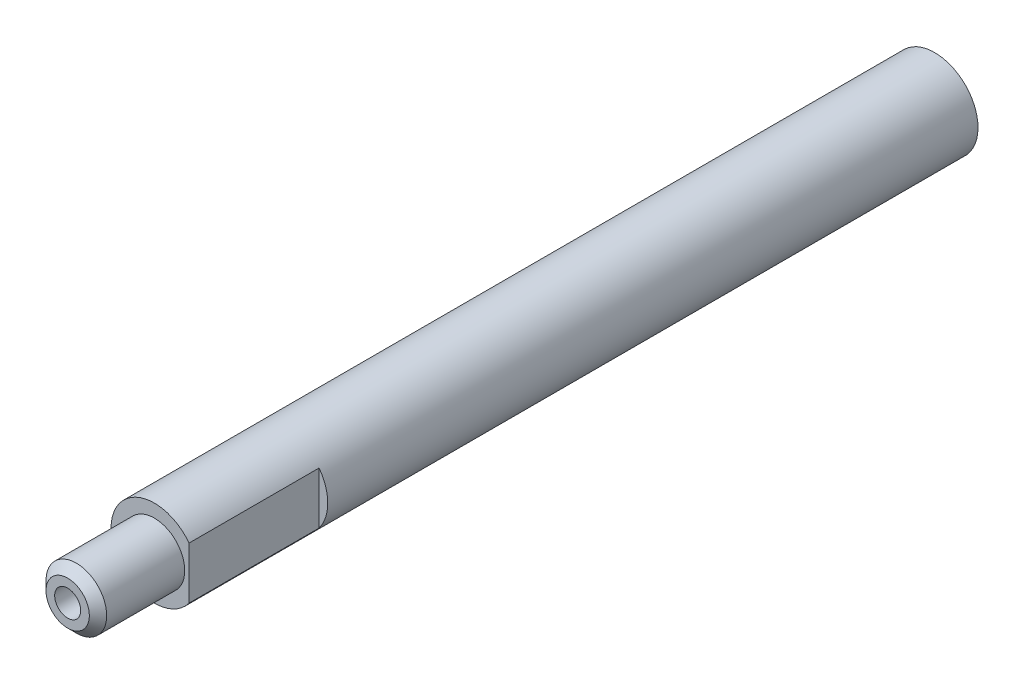
ISO-10303-21;
HEADER;
FILE_DESCRIPTION(('STEP AP214'),'2;1');
FILE_NAME('part.step','',(''),(''),'','','');
FILE_SCHEMA(('AUTOMOTIVE_DESIGN { 1 0 10303 214 1 1 1 1 }'));
ENDSEC;
DATA;
#1=APPLICATION_CONTEXT('core data for automotive mechanical design processes');
#2=APPLICATION_PROTOCOL_DEFINITION('international standard','automotive_design',2000,#1);
#3=PRODUCT_CONTEXT('',#1,'mechanical');
#4=PRODUCT('Part','Part','',(#3));
#5=PRODUCT_RELATED_PRODUCT_CATEGORY('part','',(#4));
#6=PRODUCT_DEFINITION_FORMATION('','',#4);
#7=PRODUCT_DEFINITION_CONTEXT('part definition',#1,'design');
#8=PRODUCT_DEFINITION('design','',#6,#7);
#9=PRODUCT_DEFINITION_SHAPE('','',#8);
#10=(LENGTH_UNIT() NAMED_UNIT(*) SI_UNIT(.MILLI.,.METRE.));
#11=(NAMED_UNIT(*) PLANE_ANGLE_UNIT() SI_UNIT($,.RADIAN.));
#12=(NAMED_UNIT(*) SI_UNIT($,.STERADIAN.) SOLID_ANGLE_UNIT());
#13=UNCERTAINTY_MEASURE_WITH_UNIT(LENGTH_MEASURE(1.E-05),#10,'distance_accuracy_value','');
#14=(GEOMETRIC_REPRESENTATION_CONTEXT(3) GLOBAL_UNCERTAINTY_ASSIGNED_CONTEXT((#13)) GLOBAL_UNIT_ASSIGNED_CONTEXT((#10,
#11,#12)) REPRESENTATION_CONTEXT('',''));
#15=CARTESIAN_POINT('',(0.,0.,0.));
#16=DIRECTION('',(0.,0.,1.));
#17=DIRECTION('',(1.,0.,0.));
#18=AXIS2_PLACEMENT_3D('',#15,#16,#17);
#19=CARTESIAN_POINT('',(0.,0.,100.));
#20=DIRECTION('',(0.,0.,-1.));
#21=DIRECTION('',(-1.,0.,0.));
#22=AXIS2_PLACEMENT_3D('',#19,#20,#21);
#23=CYLINDRICAL_SURFACE('',#22,5.);
#24=CARTESIAN_POINT('',(0.,0.,90.));
#25=DIRECTION('',(0.,0.,1.));
#26=DIRECTION('',(1.,0.,0.));
#27=AXIS2_PLACEMENT_3D('',#24,#25,#26);
#28=CIRCLE('',#27,5.);
#29=CARTESIAN_POINT('',(4.,3.,90.));
#30=VERTEX_POINT('',#29);
#31=CARTESIAN_POINT('',(4.,-3.,90.));
#32=VERTEX_POINT('',#31);
#33=EDGE_CURVE('E100',#30,#32,#28,.T.);
#34=ORIENTED_EDGE('',*,*,#33,.F.);
#35=DIRECTION('',(0.,0.,1.));
#36=VECTOR('',#35,1.);
#37=CARTESIAN_POINT('',(4.,3.,75.));
#38=LINE('',#37,#36);
#39=CARTESIAN_POINT('',(4.,3.,75.));
#40=VERTEX_POINT('',#39);
#41=EDGE_CURVE('E49',#40,#30,#38,.T.);
#42=ORIENTED_EDGE('',*,*,#41,.F.);
#43=CARTESIAN_POINT('',(0.,0.,75.));
#44=DIRECTION('',(0.,0.,1.));
#45=DIRECTION('',(1.,0.,0.));
#46=AXIS2_PLACEMENT_3D('',#43,#44,#45);
#47=CIRCLE('',#46,5.);
#48=CARTESIAN_POINT('',(4.,-3.,75.));
#49=VERTEX_POINT('',#48);
#50=EDGE_CURVE('E78',#49,#40,#47,.T.);
#51=ORIENTED_EDGE('',*,*,#50,.F.);
#52=DIRECTION('',(0.,0.,1.));
#53=VECTOR('',#52,1.);
#54=CARTESIAN_POINT('',(4.,-3.,75.));
#55=LINE('',#54,#53);
#56=EDGE_CURVE('E87',#49,#32,#55,.T.);
#57=ORIENTED_EDGE('',*,*,#56,.T.);
#58=EDGE_LOOP('',(#34,#42,#51,#57));
#59=FACE_BOUND('',#58,.T.);
#60=CARTESIAN_POINT('',(0.,0.,0.));
#61=DIRECTION('',(0.,0.,1.));
#62=DIRECTION('',(1.,0.,0.));
#63=AXIS2_PLACEMENT_3D('',#60,#61,#62);
#64=CIRCLE('',#63,5.);
#65=CARTESIAN_POINT('',(5.,0.,0.));
#66=VERTEX_POINT('',#65);
#67=EDGE_CURVE('E101',#66,#66,#64,.T.);
#68=ORIENTED_EDGE('',*,*,#67,.T.);
#69=EDGE_LOOP('',(#68));
#70=FACE_BOUND('',#69,.T.);
#71=ADVANCED_FACE('F34',(#59,#70),#23,.T.);
#72=CARTESIAN_POINT('',(0.,0.,0.));
#73=DIRECTION('',(0.,0.,1.));
#74=DIRECTION('',(1.,0.,0.));
#75=AXIS2_PLACEMENT_3D('',#72,#73,#74);
#76=PLANE('',#75);
#77=CARTESIAN_POINT('',(0.,0.,0.));
#78=DIRECTION('',(0.,0.,-1.));
#79=DIRECTION('',(-1.,0.,0.));
#80=AXIS2_PLACEMENT_3D('',#77,#78,#79);
#81=CIRCLE('',#80,2.);
#82=CARTESIAN_POINT('',(-2.,0.,0.));
#83=VERTEX_POINT('',#82);
#84=EDGE_CURVE('E76',#83,#83,#81,.T.);
#85=ORIENTED_EDGE('',*,*,#84,.F.);
#86=EDGE_LOOP('',(#85));
#87=FACE_BOUND('',#86,.T.);
#88=ORIENTED_EDGE('',*,*,#67,.F.);
#89=EDGE_LOOP('',(#88));
#90=FACE_BOUND('',#89,.T.);
#91=ADVANCED_FACE('F125',(#87,#90),#76,.F.);
#92=CARTESIAN_POINT('',(0.,0.,90.));
#93=DIRECTION('',(0.,0.,1.));
#94=DIRECTION('',(1.,0.,0.));
#95=AXIS2_PLACEMENT_3D('',#92,#93,#94);
#96=PLANE('',#95);
#97=DIRECTION('',(0.,-1.,0.));
#98=VECTOR('',#97,1.);
#99=CARTESIAN_POINT('',(4.,3.,90.));
#100=LINE('',#99,#98);
#101=EDGE_CURVE('E75',#30,#32,#100,.T.);
#102=ORIENTED_EDGE('',*,*,#101,.F.);
#103=ORIENTED_EDGE('',*,*,#33,.T.);
#104=EDGE_LOOP('',(#102,#103));
#105=FACE_BOUND('',#104,.T.);
#106=CARTESIAN_POINT('',(0.,0.,90.));
#107=DIRECTION('',(0.,0.,1.));
#108=DIRECTION('',(1.,0.,0.));
#109=AXIS2_PLACEMENT_3D('',#106,#107,#108);
#110=CIRCLE('',#109,3.5);
#111=CARTESIAN_POINT('',(3.5,0.,90.));
#112=VERTEX_POINT('',#111);
#113=EDGE_CURVE('E97',#112,#112,#110,.T.);
#114=ORIENTED_EDGE('',*,*,#113,.F.);
#115=EDGE_LOOP('',(#114));
#116=FACE_BOUND('',#115,.T.);
#117=ADVANCED_FACE('F130',(#105,#116),#96,.T.);
#118=CARTESIAN_POINT('',(0.,0.,90.));
#119=DIRECTION('',(0.,0.,1.));
#120=DIRECTION('',(1.,0.,0.));
#121=AXIS2_PLACEMENT_3D('',#118,#119,#120);
#122=CYLINDRICAL_SURFACE('',#121,3.5);
#123=CARTESIAN_POINT('',(0.,0.,99.));
#124=DIRECTION('',(0.,0.,1.));
#125=DIRECTION('',(1.,0.,0.));
#126=AXIS2_PLACEMENT_3D('',#123,#124,#125);
#127=CIRCLE('',#126,3.5);
#128=CARTESIAN_POINT('',(3.5,0.,99.));
#129=VERTEX_POINT('',#128);
#130=EDGE_CURVE('E12',#129,#129,#127,.F.);
#131=ORIENTED_EDGE('',*,*,#130,.T.);
#132=EDGE_LOOP('',(#131));
#133=FACE_BOUND('',#132,.T.);
#134=ORIENTED_EDGE('',*,*,#113,.T.);
#135=EDGE_LOOP('',(#134));
#136=FACE_BOUND('',#135,.T.);
#137=ADVANCED_FACE('F138',(#133,#136),#122,.T.);
#138=CARTESIAN_POINT('',(0.,0.,100.));
#139=DIRECTION('',(0.,0.,1.));
#140=DIRECTION('',(1.,0.,0.));
#141=AXIS2_PLACEMENT_3D('',#138,#139,#140);
#142=PLANE('',#141);
#143=CARTESIAN_POINT('',(0.,0.,100.));
#144=DIRECTION('',(0.,0.,1.));
#145=DIRECTION('',(1.,0.,0.));
#146=AXIS2_PLACEMENT_3D('',#143,#144,#145);
#147=CIRCLE('',#146,2.5);
#148=CARTESIAN_POINT('',(2.5,0.,100.));
#149=VERTEX_POINT('',#148);
#150=EDGE_CURVE('E42',#149,#149,#147,.T.);
#151=ORIENTED_EDGE('',*,*,#150,.T.);
#152=EDGE_LOOP('',(#151));
#153=FACE_BOUND('',#152,.T.);
#154=CARTESIAN_POINT('',(0.,0.,100.));
#155=DIRECTION('',(0.,0.,1.));
#156=DIRECTION('',(1.,0.,0.));
#157=AXIS2_PLACEMENT_3D('',#154,#155,#156);
#158=CIRCLE('',#157,1.5);
#159=CARTESIAN_POINT('',(1.5,0.,100.));
#160=VERTEX_POINT('',#159);
#161=EDGE_CURVE('E90',#160,#160,#158,.T.);
#162=ORIENTED_EDGE('',*,*,#161,.F.);
#163=EDGE_LOOP('',(#162));
#164=FACE_BOUND('',#163,.T.);
#165=ADVANCED_FACE('F108',(#153,#164),#142,.T.);
#166=CARTESIAN_POINT('',(0.,0.,90.));
#167=DIRECTION('',(0.,0.,1.));
#168=DIRECTION('',(1.,0.,0.));
#169=AXIS2_PLACEMENT_3D('',#166,#167,#168);
#170=CONICAL_SURFACE('',#169,1.5,1.02974425867665);
#171=CARTESIAN_POINT('',(0.,0.,89.0987090714587));
#172=VERTEX_POINT('',#171);
#173=VERTEX_LOOP('',#172);
#174=FACE_BOUND('',#173,.T.);
#175=CARTESIAN_POINT('',(0.,0.,90.));
#176=DIRECTION('',(0.,0.,1.));
#177=DIRECTION('',(1.,0.,0.));
#178=AXIS2_PLACEMENT_3D('',#175,#176,#177);
#179=CIRCLE('',#178,1.5);
#180=CARTESIAN_POINT('',(1.5,0.,90.));
#181=VERTEX_POINT('',#180);
#182=EDGE_CURVE('E94',#181,#181,#179,.T.);
#183=ORIENTED_EDGE('',*,*,#182,.T.);
#184=EDGE_LOOP('',(#183));
#185=FACE_BOUND('',#184,.T.);
#186=ADVANCED_FACE('F120',(#174,#185),#170,.F.);
#187=CARTESIAN_POINT('',(0.,0.,100.));
#188=DIRECTION('',(0.,0.,1.));
#189=DIRECTION('',(1.,0.,0.));
#190=AXIS2_PLACEMENT_3D('',#187,#188,#189);
#191=CYLINDRICAL_SURFACE('',#190,1.5);
#192=ORIENTED_EDGE('',*,*,#182,.F.);
#193=EDGE_LOOP('',(#192));
#194=FACE_BOUND('',#193,.T.);
#195=ORIENTED_EDGE('',*,*,#161,.T.);
#196=EDGE_LOOP('',(#195));
#197=FACE_BOUND('',#196,.T.);
#198=ADVANCED_FACE('F113',(#194,#197),#191,.F.);
#199=CARTESIAN_POINT('',(0.,0.,100.));
#200=DIRECTION('',(0.,0.,-1.));
#201=DIRECTION('',(-1.,0.,0.));
#202=AXIS2_PLACEMENT_3D('',#199,#200,#201);
#203=CONICAL_SURFACE('',#202,2.5,0.785398163397447);
#204=ORIENTED_EDGE('',*,*,#130,.F.);
#205=EDGE_LOOP('',(#204));
#206=FACE_BOUND('',#205,.T.);
#207=ORIENTED_EDGE('',*,*,#150,.F.);
#208=EDGE_LOOP('',(#207));
#209=FACE_BOUND('',#208,.T.);
#210=ADVANCED_FACE('F36',(#206,#209),#203,.T.);
#211=CARTESIAN_POINT('',(4.,3.,75.));
#212=DIRECTION('',(-1.,0.,0.));
#213=DIRECTION('',(0.,-1.,0.));
#214=AXIS2_PLACEMENT_3D('',#211,#212,#213);
#215=PLANE('',#214);
#216=ORIENTED_EDGE('',*,*,#101,.T.);
#217=ORIENTED_EDGE('',*,*,#56,.F.);
#218=DIRECTION('',(0.,-1.,0.));
#219=VECTOR('',#218,1.);
#220=CARTESIAN_POINT('',(4.,3.,75.));
#221=LINE('',#220,#219);
#222=EDGE_CURVE('E84',#40,#49,#221,.T.);
#223=ORIENTED_EDGE('',*,*,#222,.F.);
#224=ORIENTED_EDGE('',*,*,#41,.T.);
#225=EDGE_LOOP('',(#216,#217,#223,#224));
#226=FACE_BOUND('',#225,.T.);
#227=ADVANCED_FACE('F112',(#226),#215,.F.);
#228=CARTESIAN_POINT('',(0.,0.,75.));
#229=DIRECTION('',(0.,0.,1.));
#230=DIRECTION('',(1.,0.,0.));
#231=AXIS2_PLACEMENT_3D('',#228,#229,#230);
#232=PLANE('',#231);
#233=ORIENTED_EDGE('',*,*,#50,.T.);
#234=ORIENTED_EDGE('',*,*,#222,.T.);
#235=EDGE_LOOP('',(#233,#234));
#236=FACE_BOUND('',#235,.T.);
#237=ADVANCED_FACE('F69',(#236),#232,.T.);
#238=CARTESIAN_POINT('',(0.,0.,20.));
#239=DIRECTION('',(0.,0.,-1.));
#240=DIRECTION('',(-1.,0.,0.));
#241=AXIS2_PLACEMENT_3D('',#238,#239,#240);
#242=CONICAL_SURFACE('',#241,2.,1.02974425867665);
#243=CARTESIAN_POINT('',(0.,0.,21.2017212380551));
#244=VERTEX_POINT('',#243);
#245=VERTEX_LOOP('',#244);
#246=FACE_BOUND('',#245,.T.);
#247=CARTESIAN_POINT('',(0.,0.,20.));
#248=DIRECTION('',(0.,0.,-1.));
#249=DIRECTION('',(-1.,0.,0.));
#250=AXIS2_PLACEMENT_3D('',#247,#248,#249);
#251=CIRCLE('',#250,2.);
#252=CARTESIAN_POINT('',(-2.,0.,20.));
#253=VERTEX_POINT('',#252);
#254=EDGE_CURVE('E73',#253,#253,#251,.T.);
#255=ORIENTED_EDGE('',*,*,#254,.T.);
#256=EDGE_LOOP('',(#255));
#257=FACE_BOUND('',#256,.T.);
#258=ADVANCED_FACE('F65',(#246,#257),#242,.F.);
#259=CARTESIAN_POINT('',(0.,0.,0.));
#260=DIRECTION('',(0.,0.,-1.));
#261=DIRECTION('',(-1.,0.,0.));
#262=AXIS2_PLACEMENT_3D('',#259,#260,#261);
#263=CYLINDRICAL_SURFACE('',#262,2.);
#264=ORIENTED_EDGE('',*,*,#254,.F.);
#265=EDGE_LOOP('',(#264));
#266=FACE_BOUND('',#265,.T.);
#267=ORIENTED_EDGE('',*,*,#84,.T.);
#268=EDGE_LOOP('',(#267));
#269=FACE_BOUND('',#268,.T.);
#270=ADVANCED_FACE('F68',(#266,#269),#263,.F.);
#271=CLOSED_SHELL('',(#71,#91,#117,#137,#165,#186,#198,#210,#227,#237,#258,#270));
#272=MANIFOLD_SOLID_BREP('B2',#271);
#273=ADVANCED_BREP_SHAPE_REPRESENTATION('',(#18,#272),#14);
#274=SHAPE_DEFINITION_REPRESENTATION(#9,#273);
ENDSEC;
END-ISO-10303-21;
